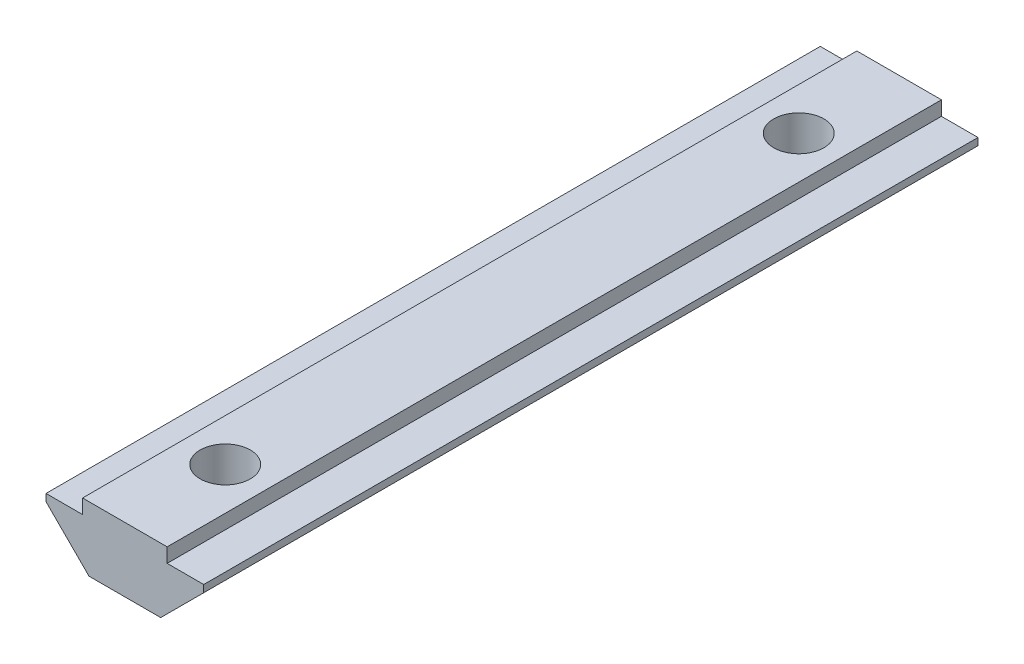
ISO-10303-21;
HEADER;
FILE_DESCRIPTION(('STEP AP214'),'2;1');
FILE_NAME('part.step','',(''),(''),'','','');
FILE_SCHEMA(('AUTOMOTIVE_DESIGN { 1 0 10303 214 1 1 1 1 }'));
ENDSEC;
DATA;
#1=APPLICATION_CONTEXT('core data for automotive mechanical design processes');
#2=APPLICATION_PROTOCOL_DEFINITION('international standard','automotive_design',2000,#1);
#3=PRODUCT_CONTEXT('',#1,'mechanical');
#4=PRODUCT('Part','Part','',(#3));
#5=PRODUCT_RELATED_PRODUCT_CATEGORY('part','',(#4));
#6=PRODUCT_DEFINITION_FORMATION('','',#4);
#7=PRODUCT_DEFINITION_CONTEXT('part definition',#1,'design');
#8=PRODUCT_DEFINITION('design','',#6,#7);
#9=PRODUCT_DEFINITION_SHAPE('','',#8);
#10=(LENGTH_UNIT() NAMED_UNIT(*) SI_UNIT(.MILLI.,.METRE.));
#11=(NAMED_UNIT(*) PLANE_ANGLE_UNIT() SI_UNIT($,.RADIAN.));
#12=(NAMED_UNIT(*) SI_UNIT($,.STERADIAN.) SOLID_ANGLE_UNIT());
#13=UNCERTAINTY_MEASURE_WITH_UNIT(LENGTH_MEASURE(1.E-05),#10,'distance_accuracy_value','');
#14=(GEOMETRIC_REPRESENTATION_CONTEXT(3) GLOBAL_UNCERTAINTY_ASSIGNED_CONTEXT((#13)) GLOBAL_UNIT_ASSIGNED_CONTEXT((#10,
#11,#12)) REPRESENTATION_CONTEXT('',''));
#15=CARTESIAN_POINT('',(0.,0.,0.));
#16=DIRECTION('',(0.,0.,1.));
#17=DIRECTION('',(1.,0.,0.));
#18=AXIS2_PLACEMENT_3D('',#15,#16,#17);
#19=CARTESIAN_POINT('',(2.5,0.,54.));
#20=DIRECTION('',(-0.707106781186548,0.707106781186547,0.));
#21=DIRECTION('',(-0.707106781186547,-0.707106781186548,0.));
#22=AXIS2_PLACEMENT_3D('',#19,#20,#21);
#23=PLANE('',#22);
#24=DIRECTION('',(0.707106781186547,0.707106781186548,0.));
#25=VECTOR('',#24,1.);
#26=CARTESIAN_POINT('',(2.5,0.,0.));
#27=LINE('',#26,#25);
#28=CARTESIAN_POINT('',(2.5,0.,0.));
#29=VERTEX_POINT('',#28);
#30=CARTESIAN_POINT('',(5.5,3.,0.));
#31=VERTEX_POINT('',#30);
#32=EDGE_CURVE('E140',#29,#31,#27,.T.);
#33=ORIENTED_EDGE('',*,*,#32,.T.);
#34=DIRECTION('',(0.,0.,-1.));
#35=VECTOR('',#34,1.);
#36=CARTESIAN_POINT('',(5.5,3.,54.));
#37=LINE('',#36,#35);
#38=CARTESIAN_POINT('',(5.5,3.,54.));
#39=VERTEX_POINT('',#38);
#40=EDGE_CURVE('E11',#39,#31,#37,.T.);
#41=ORIENTED_EDGE('',*,*,#40,.F.);
#42=DIRECTION('',(0.707106781186547,0.707106781186548,0.));
#43=VECTOR('',#42,1.);
#44=CARTESIAN_POINT('',(2.5,0.,54.));
#45=LINE('',#44,#43);
#46=CARTESIAN_POINT('',(2.5,0.,54.));
#47=VERTEX_POINT('',#46);
#48=EDGE_CURVE('E159',#47,#39,#45,.T.);
#49=ORIENTED_EDGE('',*,*,#48,.F.);
#50=DIRECTION('',(0.,0.,-1.));
#51=VECTOR('',#50,1.);
#52=CARTESIAN_POINT('',(2.5,0.,54.));
#53=LINE('',#52,#51);
#54=EDGE_CURVE('E136',#47,#29,#53,.T.);
#55=ORIENTED_EDGE('',*,*,#54,.T.);
#56=EDGE_LOOP('',(#33,#41,#49,#55));
#57=FACE_BOUND('',#56,.T.);
#58=ADVANCED_FACE('F32',(#57),#23,.F.);
#59=CARTESIAN_POINT('',(5.5,3.,54.));
#60=DIRECTION('',(-1.,0.,0.));
#61=DIRECTION('',(0.,0.,1.));
#62=AXIS2_PLACEMENT_3D('',#59,#60,#61);
#63=PLANE('',#62);
#64=DIRECTION('',(0.,1.,0.));
#65=VECTOR('',#64,1.);
#66=CARTESIAN_POINT('',(5.5,3.,0.));
#67=LINE('',#66,#65);
#68=CARTESIAN_POINT('',(5.5,3.5,0.));
#69=VERTEX_POINT('',#68);
#70=EDGE_CURVE('E143',#31,#69,#67,.T.);
#71=ORIENTED_EDGE('',*,*,#70,.T.);
#72=DIRECTION('',(0.,0.,-1.));
#73=VECTOR('',#72,1.);
#74=CARTESIAN_POINT('',(5.5,3.5,54.));
#75=LINE('',#74,#73);
#76=CARTESIAN_POINT('',(5.5,3.5,54.));
#77=VERTEX_POINT('',#76);
#78=EDGE_CURVE('E40',#77,#69,#75,.T.);
#79=ORIENTED_EDGE('',*,*,#78,.F.);
#80=DIRECTION('',(0.,1.,0.));
#81=VECTOR('',#80,1.);
#82=CARTESIAN_POINT('',(5.5,3.,54.));
#83=LINE('',#82,#81);
#84=EDGE_CURVE('E97',#39,#77,#83,.T.);
#85=ORIENTED_EDGE('',*,*,#84,.F.);
#86=ORIENTED_EDGE('',*,*,#40,.T.);
#87=EDGE_LOOP('',(#71,#79,#85,#86));
#88=FACE_BOUND('',#87,.T.);
#89=ADVANCED_FACE('F244',(#88),#63,.F.);
#90=CARTESIAN_POINT('',(5.5,3.5,54.));
#91=DIRECTION('',(0.,-1.,0.));
#92=DIRECTION('',(1.,0.,0.));
#93=AXIS2_PLACEMENT_3D('',#90,#91,#92);
#94=PLANE('',#93);
#95=DIRECTION('',(-1.,0.,0.));
#96=VECTOR('',#95,1.);
#97=CARTESIAN_POINT('',(5.5,3.5,0.));
#98=LINE('',#97,#96);
#99=CARTESIAN_POINT('',(2.95,3.5,0.));
#100=VERTEX_POINT('',#99);
#101=EDGE_CURVE('E146',#69,#100,#98,.T.);
#102=ORIENTED_EDGE('',*,*,#101,.T.);
#103=DIRECTION('',(0.,0.,-1.));
#104=VECTOR('',#103,1.);
#105=CARTESIAN_POINT('',(2.95,3.5,54.));
#106=LINE('',#105,#104);
#107=CARTESIAN_POINT('',(2.95,3.5,54.));
#108=VERTEX_POINT('',#107);
#109=EDGE_CURVE('E172',#108,#100,#106,.T.);
#110=ORIENTED_EDGE('',*,*,#109,.F.);
#111=DIRECTION('',(-1.,0.,0.));
#112=VECTOR('',#111,1.);
#113=CARTESIAN_POINT('',(5.5,3.5,54.));
#114=LINE('',#113,#112);
#115=EDGE_CURVE('E180',#77,#108,#114,.T.);
#116=ORIENTED_EDGE('',*,*,#115,.F.);
#117=ORIENTED_EDGE('',*,*,#78,.T.);
#118=EDGE_LOOP('',(#102,#110,#116,#117));
#119=FACE_BOUND('',#118,.T.);
#120=ADVANCED_FACE('F178',(#119),#94,.F.);
#121=CARTESIAN_POINT('',(2.95,3.5,54.));
#122=DIRECTION('',(-1.,0.,0.));
#123=DIRECTION('',(0.,0.,1.));
#124=AXIS2_PLACEMENT_3D('',#121,#122,#123);
#125=PLANE('',#124);
#126=DIRECTION('',(0.,1.,0.));
#127=VECTOR('',#126,1.);
#128=CARTESIAN_POINT('',(2.95,3.5,0.));
#129=LINE('',#128,#127);
#130=CARTESIAN_POINT('',(2.95,4.5,0.));
#131=VERTEX_POINT('',#130);
#132=EDGE_CURVE('E148',#100,#131,#129,.T.);
#133=ORIENTED_EDGE('',*,*,#132,.T.);
#134=DIRECTION('',(0.,0.,-1.));
#135=VECTOR('',#134,1.);
#136=CARTESIAN_POINT('',(2.95,4.5,54.));
#137=LINE('',#136,#135);
#138=CARTESIAN_POINT('',(2.95,4.5,54.));
#139=VERTEX_POINT('',#138);
#140=EDGE_CURVE('E169',#139,#131,#137,.T.);
#141=ORIENTED_EDGE('',*,*,#140,.F.);
#142=DIRECTION('',(0.,1.,0.));
#143=VECTOR('',#142,1.);
#144=CARTESIAN_POINT('',(2.95,3.5,54.));
#145=LINE('',#144,#143);
#146=EDGE_CURVE('E198',#108,#139,#145,.T.);
#147=ORIENTED_EDGE('',*,*,#146,.F.);
#148=ORIENTED_EDGE('',*,*,#109,.T.);
#149=EDGE_LOOP('',(#133,#141,#147,#148));
#150=FACE_BOUND('',#149,.T.);
#151=ADVANCED_FACE('F189',(#150),#125,.F.);
#152=CARTESIAN_POINT('',(2.95,4.5,54.));
#153=DIRECTION('',(0.,-1.,0.));
#154=DIRECTION('',(1.,0.,0.));
#155=AXIS2_PLACEMENT_3D('',#152,#153,#154);
#156=PLANE('',#155);
#157=CARTESIAN_POINT('',(0.,4.5,47.));
#158=DIRECTION('',(0.,1.,0.));
#159=DIRECTION('',(0.,0.,-1.));
#160=AXIS2_PLACEMENT_3D('',#157,#158,#159);
#161=CIRCLE('',#160,1.75);
#162=CARTESIAN_POINT('',(0.,4.5,45.25));
#163=VERTEX_POINT('',#162);
#164=EDGE_CURVE('E212',#163,#163,#161,.T.);
#165=ORIENTED_EDGE('',*,*,#164,.F.);
#166=EDGE_LOOP('',(#165));
#167=FACE_BOUND('',#166,.T.);
#168=CARTESIAN_POINT('',(0.,4.5,7.));
#169=DIRECTION('',(0.,1.,0.));
#170=DIRECTION('',(0.,0.,1.));
#171=AXIS2_PLACEMENT_3D('',#168,#169,#170);
#172=CIRCLE('',#171,1.75);
#173=CARTESIAN_POINT('',(0.,4.5,8.75));
#174=VERTEX_POINT('',#173);
#175=EDGE_CURVE('E206',#174,#174,#172,.T.);
#176=ORIENTED_EDGE('',*,*,#175,.F.);
#177=EDGE_LOOP('',(#176));
#178=FACE_BOUND('',#177,.T.);
#179=DIRECTION('',(-1.,0.,0.));
#180=VECTOR('',#179,1.);
#181=CARTESIAN_POINT('',(2.95,4.5,0.));
#182=LINE('',#181,#180);
#183=CARTESIAN_POINT('',(-2.95,4.5,0.));
#184=VERTEX_POINT('',#183);
#185=EDGE_CURVE('E150',#131,#184,#182,.T.);
#186=ORIENTED_EDGE('',*,*,#185,.T.);
#187=DIRECTION('',(0.,0.,-1.));
#188=VECTOR('',#187,1.);
#189=CARTESIAN_POINT('',(-2.95,4.5,54.));
#190=LINE('',#189,#188);
#191=CARTESIAN_POINT('',(-2.95,4.5,54.));
#192=VERTEX_POINT('',#191);
#193=EDGE_CURVE('E166',#192,#184,#190,.T.);
#194=ORIENTED_EDGE('',*,*,#193,.F.);
#195=DIRECTION('',(-1.,0.,0.));
#196=VECTOR('',#195,1.);
#197=CARTESIAN_POINT('',(2.95,4.5,54.));
#198=LINE('',#197,#196);
#199=EDGE_CURVE('E195',#139,#192,#198,.T.);
#200=ORIENTED_EDGE('',*,*,#199,.F.);
#201=ORIENTED_EDGE('',*,*,#140,.T.);
#202=EDGE_LOOP('',(#186,#194,#200,#201));
#203=FACE_BOUND('',#202,.T.);
#204=ADVANCED_FACE('F193',(#167,#178,#203),#156,.F.);
#205=CARTESIAN_POINT('',(-2.95,3.5,54.));
#206=DIRECTION('',(1.,0.,0.));
#207=DIRECTION('',(0.,0.,-1.));
#208=AXIS2_PLACEMENT_3D('',#205,#206,#207);
#209=PLANE('',#208);
#210=DIRECTION('',(0.,-1.,0.));
#211=VECTOR('',#210,1.);
#212=CARTESIAN_POINT('',(-2.95,3.5,0.));
#213=LINE('',#212,#211);
#214=CARTESIAN_POINT('',(-2.95,3.5,0.));
#215=VERTEX_POINT('',#214);
#216=EDGE_CURVE('E152',#184,#215,#213,.T.);
#217=ORIENTED_EDGE('',*,*,#216,.T.);
#218=DIRECTION('',(0.,0.,-1.));
#219=VECTOR('',#218,1.);
#220=CARTESIAN_POINT('',(-2.95,3.5,54.));
#221=LINE('',#220,#219);
#222=CARTESIAN_POINT('',(-2.95,3.5,54.));
#223=VERTEX_POINT('',#222);
#224=EDGE_CURVE('E163',#223,#215,#221,.T.);
#225=ORIENTED_EDGE('',*,*,#224,.F.);
#226=DIRECTION('',(0.,-1.,0.));
#227=VECTOR('',#226,1.);
#228=CARTESIAN_POINT('',(-2.95,3.5,54.));
#229=LINE('',#228,#227);
#230=EDGE_CURVE('E197',#192,#223,#229,.T.);
#231=ORIENTED_EDGE('',*,*,#230,.F.);
#232=ORIENTED_EDGE('',*,*,#193,.T.);
#233=EDGE_LOOP('',(#217,#225,#231,#232));
#234=FACE_BOUND('',#233,.T.);
#235=ADVANCED_FACE('F230',(#234),#209,.F.);
#236=CARTESIAN_POINT('',(-5.5,3.5,54.));
#237=DIRECTION('',(0.,-1.,0.));
#238=DIRECTION('',(1.,0.,0.));
#239=AXIS2_PLACEMENT_3D('',#236,#237,#238);
#240=PLANE('',#239);
#241=DIRECTION('',(-1.,0.,0.));
#242=VECTOR('',#241,1.);
#243=CARTESIAN_POINT('',(-5.5,3.5,0.));
#244=LINE('',#243,#242);
#245=CARTESIAN_POINT('',(-5.5,3.5,0.));
#246=VERTEX_POINT('',#245);
#247=EDGE_CURVE('E154',#215,#246,#244,.T.);
#248=ORIENTED_EDGE('',*,*,#247,.T.);
#249=DIRECTION('',(0.,0.,-1.));
#250=VECTOR('',#249,1.);
#251=CARTESIAN_POINT('',(-5.5,3.5,54.));
#252=LINE('',#251,#250);
#253=CARTESIAN_POINT('',(-5.5,3.5,54.));
#254=VERTEX_POINT('',#253);
#255=EDGE_CURVE('E131',#254,#246,#252,.T.);
#256=ORIENTED_EDGE('',*,*,#255,.F.);
#257=DIRECTION('',(-1.,0.,0.));
#258=VECTOR('',#257,1.);
#259=CARTESIAN_POINT('',(-5.5,3.5,54.));
#260=LINE('',#259,#258);
#261=EDGE_CURVE('E122',#223,#254,#260,.T.);
#262=ORIENTED_EDGE('',*,*,#261,.F.);
#263=ORIENTED_EDGE('',*,*,#224,.T.);
#264=EDGE_LOOP('',(#248,#256,#262,#263));
#265=FACE_BOUND('',#264,.T.);
#266=ADVANCED_FACE('F253',(#265),#240,.F.);
#267=CARTESIAN_POINT('',(-5.5,3.,54.));
#268=DIRECTION('',(1.,0.,0.));
#269=DIRECTION('',(0.,0.,-1.));
#270=AXIS2_PLACEMENT_3D('',#267,#268,#269);
#271=PLANE('',#270);
#272=DIRECTION('',(0.,-1.,0.));
#273=VECTOR('',#272,1.);
#274=CARTESIAN_POINT('',(-5.5,3.,0.));
#275=LINE('',#274,#273);
#276=CARTESIAN_POINT('',(-5.5,3.,0.));
#277=VERTEX_POINT('',#276);
#278=EDGE_CURVE('E130',#246,#277,#275,.T.);
#279=ORIENTED_EDGE('',*,*,#278,.T.);
#280=DIRECTION('',(0.,0.,-1.));
#281=VECTOR('',#280,1.);
#282=CARTESIAN_POINT('',(-5.5,3.,54.));
#283=LINE('',#282,#281);
#284=CARTESIAN_POINT('',(-5.5,3.,54.));
#285=VERTEX_POINT('',#284);
#286=EDGE_CURVE('E127',#285,#277,#283,.T.);
#287=ORIENTED_EDGE('',*,*,#286,.F.);
#288=DIRECTION('',(0.,-1.,0.));
#289=VECTOR('',#288,1.);
#290=CARTESIAN_POINT('',(-5.5,3.,54.));
#291=LINE('',#290,#289);
#292=EDGE_CURVE('E116',#254,#285,#291,.T.);
#293=ORIENTED_EDGE('',*,*,#292,.F.);
#294=ORIENTED_EDGE('',*,*,#255,.T.);
#295=EDGE_LOOP('',(#279,#287,#293,#294));
#296=FACE_BOUND('',#295,.T.);
#297=ADVANCED_FACE('F128',(#296),#271,.F.);
#298=CARTESIAN_POINT('',(-2.5,0.,54.));
#299=DIRECTION('',(0.707106781186547,0.707106781186548,0.));
#300=DIRECTION('',(-0.707106781186548,0.707106781186547,0.));
#301=AXIS2_PLACEMENT_3D('',#298,#299,#300);
#302=PLANE('',#301);
#303=DIRECTION('',(0.707106781186548,-0.707106781186547,0.));
#304=VECTOR('',#303,1.);
#305=CARTESIAN_POINT('',(-2.5,0.,0.));
#306=LINE('',#305,#304);
#307=CARTESIAN_POINT('',(-2.5,0.,0.));
#308=VERTEX_POINT('',#307);
#309=EDGE_CURVE('E83',#277,#308,#306,.T.);
#310=ORIENTED_EDGE('',*,*,#309,.T.);
#311=DIRECTION('',(0.,0.,-1.));
#312=VECTOR('',#311,1.);
#313=CARTESIAN_POINT('',(-2.5,0.,54.));
#314=LINE('',#313,#312);
#315=CARTESIAN_POINT('',(-2.5,0.,54.));
#316=VERTEX_POINT('',#315);
#317=EDGE_CURVE('E132',#316,#308,#314,.T.);
#318=ORIENTED_EDGE('',*,*,#317,.F.);
#319=DIRECTION('',(0.707106781186548,-0.707106781186547,0.));
#320=VECTOR('',#319,1.);
#321=CARTESIAN_POINT('',(-2.5,0.,54.));
#322=LINE('',#321,#320);
#323=EDGE_CURVE('E120',#285,#316,#322,.T.);
#324=ORIENTED_EDGE('',*,*,#323,.F.);
#325=ORIENTED_EDGE('',*,*,#286,.T.);
#326=EDGE_LOOP('',(#310,#318,#324,#325));
#327=FACE_BOUND('',#326,.T.);
#328=ADVANCED_FACE('F134',(#327),#302,.F.);
#329=CARTESIAN_POINT('',(-2.5,0.,54.));
#330=DIRECTION('',(0.,1.,0.));
#331=DIRECTION('',(-1.,0.,0.));
#332=AXIS2_PLACEMENT_3D('',#329,#330,#331);
#333=PLANE('',#332);
#334=CARTESIAN_POINT('',(0.,0.,47.));
#335=DIRECTION('',(0.,1.,0.));
#336=DIRECTION('',(0.,0.,-1.));
#337=AXIS2_PLACEMENT_3D('',#334,#335,#336);
#338=CIRCLE('',#337,1.75);
#339=CARTESIAN_POINT('',(0.,0.,45.25));
#340=VERTEX_POINT('',#339);
#341=EDGE_CURVE('E209',#340,#340,#338,.T.);
#342=ORIENTED_EDGE('',*,*,#341,.T.);
#343=EDGE_LOOP('',(#342));
#344=FACE_BOUND('',#343,.T.);
#345=CARTESIAN_POINT('',(0.,0.,7.));
#346=DIRECTION('',(0.,1.,0.));
#347=DIRECTION('',(0.,0.,1.));
#348=AXIS2_PLACEMENT_3D('',#345,#346,#347);
#349=CIRCLE('',#348,1.75);
#350=CARTESIAN_POINT('',(0.,0.,8.75));
#351=VERTEX_POINT('',#350);
#352=EDGE_CURVE('E144',#351,#351,#349,.T.);
#353=ORIENTED_EDGE('',*,*,#352,.T.);
#354=EDGE_LOOP('',(#353));
#355=FACE_BOUND('',#354,.T.);
#356=DIRECTION('',(1.,0.,0.));
#357=VECTOR('',#356,1.);
#358=CARTESIAN_POINT('',(-2.5,0.,0.));
#359=LINE('',#358,#357);
#360=EDGE_CURVE('E89',#308,#29,#359,.T.);
#361=ORIENTED_EDGE('',*,*,#360,.T.);
#362=ORIENTED_EDGE('',*,*,#54,.F.);
#363=DIRECTION('',(1.,0.,0.));
#364=VECTOR('',#363,1.);
#365=CARTESIAN_POINT('',(-2.5,0.,54.));
#366=LINE('',#365,#364);
#367=EDGE_CURVE('E48',#316,#47,#366,.T.);
#368=ORIENTED_EDGE('',*,*,#367,.F.);
#369=ORIENTED_EDGE('',*,*,#317,.T.);
#370=EDGE_LOOP('',(#361,#362,#368,#369));
#371=FACE_BOUND('',#370,.T.);
#372=ADVANCED_FACE('F218',(#344,#355,#371),#333,.F.);
#373=CARTESIAN_POINT('',(0.,0.,54.));
#374=DIRECTION('',(0.,0.,1.));
#375=DIRECTION('',(1.,0.,0.));
#376=AXIS2_PLACEMENT_3D('',#373,#374,#375);
#377=PLANE('',#376);
#378=ORIENTED_EDGE('',*,*,#48,.T.);
#379=ORIENTED_EDGE('',*,*,#84,.T.);
#380=ORIENTED_EDGE('',*,*,#115,.T.);
#381=ORIENTED_EDGE('',*,*,#146,.T.);
#382=ORIENTED_EDGE('',*,*,#199,.T.);
#383=ORIENTED_EDGE('',*,*,#230,.T.);
#384=ORIENTED_EDGE('',*,*,#261,.T.);
#385=ORIENTED_EDGE('',*,*,#292,.T.);
#386=ORIENTED_EDGE('',*,*,#323,.T.);
#387=ORIENTED_EDGE('',*,*,#367,.T.);
#388=EDGE_LOOP('',(#378,#379,#380,#381,#382,#383,#384,#385,#386,#387));
#389=FACE_BOUND('',#388,.T.);
#390=ADVANCED_FACE('F118',(#389),#377,.T.);
#391=CARTESIAN_POINT('',(0.,0.,0.));
#392=DIRECTION('',(0.,0.,1.));
#393=DIRECTION('',(1.,0.,0.));
#394=AXIS2_PLACEMENT_3D('',#391,#392,#393);
#395=PLANE('',#394);
#396=ORIENTED_EDGE('',*,*,#32,.F.);
#397=ORIENTED_EDGE('',*,*,#360,.F.);
#398=ORIENTED_EDGE('',*,*,#309,.F.);
#399=ORIENTED_EDGE('',*,*,#278,.F.);
#400=ORIENTED_EDGE('',*,*,#247,.F.);
#401=ORIENTED_EDGE('',*,*,#216,.F.);
#402=ORIENTED_EDGE('',*,*,#185,.F.);
#403=ORIENTED_EDGE('',*,*,#132,.F.);
#404=ORIENTED_EDGE('',*,*,#101,.F.);
#405=ORIENTED_EDGE('',*,*,#70,.F.);
#406=EDGE_LOOP('',(#396,#397,#398,#399,#400,#401,#402,#403,#404,#405));
#407=FACE_BOUND('',#406,.T.);
#408=ADVANCED_FACE('F184',(#407),#395,.F.);
#409=CARTESIAN_POINT('',(0.,0.,7.));
#410=DIRECTION('',(0.,1.,0.));
#411=DIRECTION('',(0.,0.,1.));
#412=AXIS2_PLACEMENT_3D('',#409,#410,#411);
#413=CYLINDRICAL_SURFACE('',#412,1.75);
#414=ORIENTED_EDGE('',*,*,#352,.F.);
#415=EDGE_LOOP('',(#414));
#416=FACE_BOUND('',#415,.T.);
#417=ORIENTED_EDGE('',*,*,#175,.T.);
#418=EDGE_LOOP('',(#417));
#419=FACE_BOUND('',#418,.T.);
#420=ADVANCED_FACE('F224',(#416,#419),#413,.F.);
#421=CARTESIAN_POINT('',(0.,0.,47.));
#422=DIRECTION('',(0.,1.,0.));
#423=DIRECTION('',(0.,0.,1.));
#424=AXIS2_PLACEMENT_3D('',#421,#422,#423);
#425=CYLINDRICAL_SURFACE('',#424,1.75);
#426=ORIENTED_EDGE('',*,*,#341,.F.);
#427=EDGE_LOOP('',(#426));
#428=FACE_BOUND('',#427,.T.);
#429=ORIENTED_EDGE('',*,*,#164,.T.);
#430=EDGE_LOOP('',(#429));
#431=FACE_BOUND('',#430,.T.);
#432=ADVANCED_FACE('F221',(#428,#431),#425,.F.);
#433=CLOSED_SHELL('',(#58,#89,#120,#151,#204,#235,#266,#297,#328,#372,#390,#408,#420,#432));
#434=MANIFOLD_SOLID_BREP('B2',#433);
#435=ADVANCED_BREP_SHAPE_REPRESENTATION('',(#18,#434),#14);
#436=SHAPE_DEFINITION_REPRESENTATION(#9,#435);
ENDSEC;
END-ISO-10303-21;
